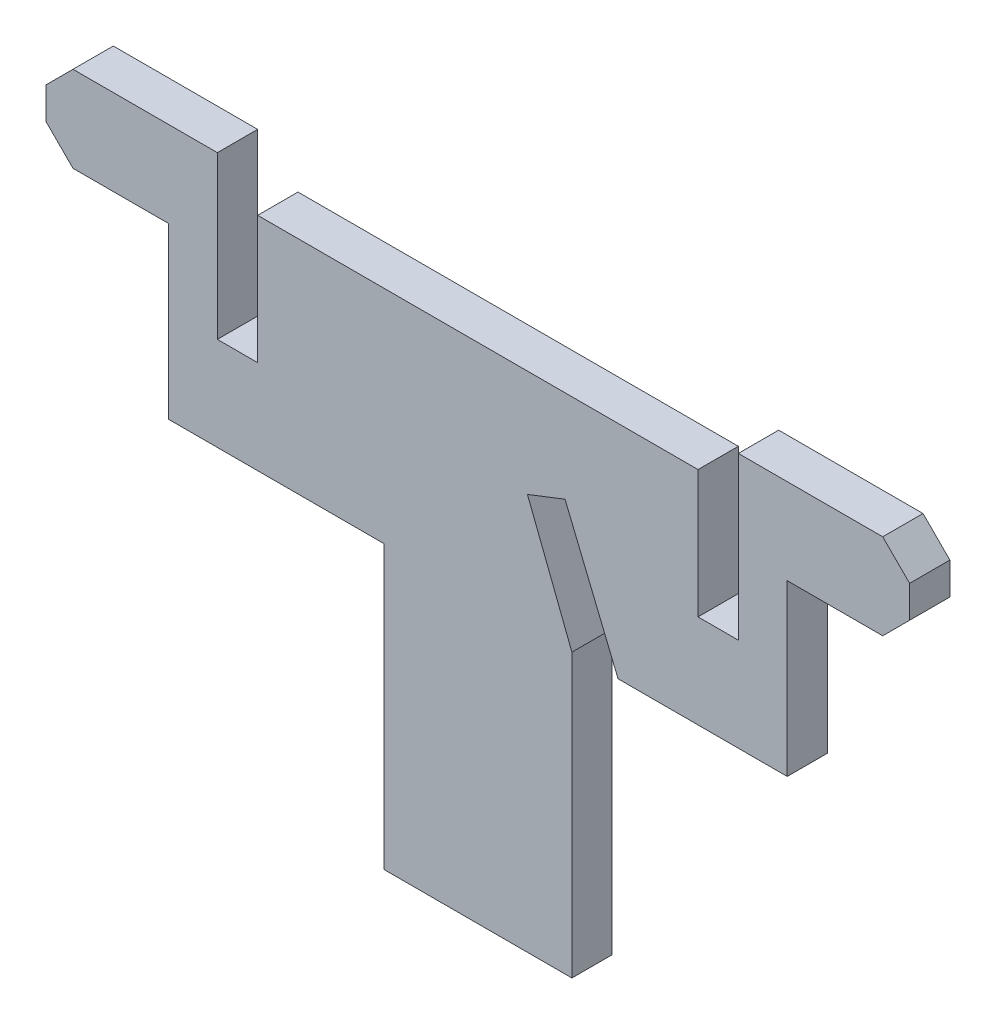
ISO-10303-21;
HEADER;
FILE_DESCRIPTION(('STEP AP214'),'2;1');
FILE_NAME('part.step','',(''),(''),'','','');
FILE_SCHEMA(('AUTOMOTIVE_DESIGN { 1 0 10303 214 1 1 1 1 }'));
ENDSEC;
DATA;
#1=APPLICATION_CONTEXT('core data for automotive mechanical design processes');
#2=APPLICATION_PROTOCOL_DEFINITION('international standard','automotive_design',2000,#1);
#3=PRODUCT_CONTEXT('',#1,'mechanical');
#4=PRODUCT('Part','Part','',(#3));
#5=PRODUCT_RELATED_PRODUCT_CATEGORY('part','',(#4));
#6=PRODUCT_DEFINITION_FORMATION('','',#4);
#7=PRODUCT_DEFINITION_CONTEXT('part definition',#1,'design');
#8=PRODUCT_DEFINITION('design','',#6,#7);
#9=PRODUCT_DEFINITION_SHAPE('','',#8);
#10=(LENGTH_UNIT() NAMED_UNIT(*) SI_UNIT(.MILLI.,.METRE.));
#11=(NAMED_UNIT(*) PLANE_ANGLE_UNIT() SI_UNIT($,.RADIAN.));
#12=(NAMED_UNIT(*) SI_UNIT($,.STERADIAN.) SOLID_ANGLE_UNIT());
#13=UNCERTAINTY_MEASURE_WITH_UNIT(LENGTH_MEASURE(1.E-05),#10,'distance_accuracy_value','');
#14=(GEOMETRIC_REPRESENTATION_CONTEXT(3) GLOBAL_UNCERTAINTY_ASSIGNED_CONTEXT((#13)) GLOBAL_UNIT_ASSIGNED_CONTEXT((#10,
#11,#12)) REPRESENTATION_CONTEXT('',''));
#15=CARTESIAN_POINT('',(0.,0.,0.));
#16=DIRECTION('',(0.,0.,1.));
#17=DIRECTION('',(1.,0.,0.));
#18=AXIS2_PLACEMENT_3D('',#15,#16,#17);
#19=CARTESIAN_POINT('',(496.63807505606,-79.1638014320061,2.99999999999992));
#20=DIRECTION('',(0.,-1.,0.));
#21=DIRECTION('',(0.,0.,-1.));
#22=AXIS2_PLACEMENT_3D('',#19,#20,#21);
#23=PLANE('',#22);
#24=DIRECTION('',(-1.,0.,0.));
#25=VECTOR('',#24,1.);
#26=CARTESIAN_POINT('',(496.63807505606,-79.1638014320061,0.));
#27=LINE('',#26,#25);
#28=CARTESIAN_POINT('',(507.382666581557,-79.1638014320062,0.));
#29=VERTEX_POINT('',#28);
#30=CARTESIAN_POINT('',(496.63807505606,-79.1638014320061,0.));
#31=VERTEX_POINT('',#30);
#32=EDGE_CURVE('E214',#29,#31,#27,.T.);
#33=ORIENTED_EDGE('',*,*,#32,.T.);
#34=DIRECTION('',(0.,0.,-1.));
#35=VECTOR('',#34,1.);
#36=CARTESIAN_POINT('',(496.63807505606,-79.1638014320061,2.99999999999992));
#37=LINE('',#36,#35);
#38=CARTESIAN_POINT('',(496.63807505606,-79.1638014320061,2.99999999999992));
#39=VERTEX_POINT('',#38);
#40=EDGE_CURVE('E11',#39,#31,#37,.T.);
#41=ORIENTED_EDGE('',*,*,#40,.F.);
#42=DIRECTION('',(-1.,0.,0.));
#43=VECTOR('',#42,1.);
#44=CARTESIAN_POINT('',(496.63807505606,-79.1638014320061,2.99999999999992));
#45=LINE('',#44,#43);
#46=CARTESIAN_POINT('',(507.382666581557,-79.1638014320062,2.99999999999989));
#47=VERTEX_POINT('',#46);
#48=EDGE_CURVE('E279',#47,#39,#45,.T.);
#49=ORIENTED_EDGE('',*,*,#48,.F.);
#50=DIRECTION('',(0.,0.,-1.));
#51=VECTOR('',#50,1.);
#52=CARTESIAN_POINT('',(507.382666581557,-79.1638014320062,2.99999999999989));
#53=LINE('',#52,#51);
#54=EDGE_CURVE('E227',#47,#29,#53,.T.);
#55=ORIENTED_EDGE('',*,*,#54,.T.);
#56=EDGE_LOOP('',(#33,#41,#49,#55));
#57=FACE_BOUND('',#56,.T.);
#58=ADVANCED_FACE('F32',(#57),#23,.F.);
#59=CARTESIAN_POINT('',(496.63807505606,-91.1989851839189,2.99999999999992));
#60=DIRECTION('',(1.,0.,0.));
#61=DIRECTION('',(0.,0.,-1.));
#62=AXIS2_PLACEMENT_3D('',#59,#60,#61);
#63=PLANE('',#62);
#64=DIRECTION('',(0.,-1.,0.));
#65=VECTOR('',#64,1.);
#66=CARTESIAN_POINT('',(496.63807505606,-91.1989851839189,-1.04083408558608E-13));
#67=LINE('',#66,#65);
#68=CARTESIAN_POINT('',(496.63807505606,-91.1989851839189,-1.04083408558608E-13));
#69=VERTEX_POINT('',#68);
#70=EDGE_CURVE('E210',#31,#69,#67,.T.);
#71=ORIENTED_EDGE('',*,*,#70,.T.);
#72=DIRECTION('',(0.,0.,-1.));
#73=VECTOR('',#72,1.);
#74=CARTESIAN_POINT('',(496.63807505606,-91.1989851839189,2.99999999999992));
#75=LINE('',#74,#73);
#76=CARTESIAN_POINT('',(496.63807505606,-91.1989851839189,2.99999999999992));
#77=VERTEX_POINT('',#76);
#78=EDGE_CURVE('E39',#77,#69,#75,.T.);
#79=ORIENTED_EDGE('',*,*,#78,.F.);
#80=DIRECTION('',(0.,-1.,0.));
#81=VECTOR('',#80,1.);
#82=CARTESIAN_POINT('',(496.63807505606,-91.1989851839189,2.99999999999992));
#83=LINE('',#82,#81);
#84=EDGE_CURVE('E223',#39,#77,#83,.T.);
#85=ORIENTED_EDGE('',*,*,#84,.F.);
#86=ORIENTED_EDGE('',*,*,#40,.T.);
#87=EDGE_LOOP('',(#71,#79,#85,#86));
#88=FACE_BOUND('',#87,.T.);
#89=ADVANCED_FACE('F222',(#88),#63,.F.);
#90=CARTESIAN_POINT('',(493.63807505606,-91.1989851839189,2.99999999999992));
#91=DIRECTION('',(0.,-1.,0.));
#92=DIRECTION('',(0.,0.,-1.));
#93=AXIS2_PLACEMENT_3D('',#90,#91,#92);
#94=PLANE('',#93);
#95=DIRECTION('',(-1.,0.,0.));
#96=VECTOR('',#95,1.);
#97=CARTESIAN_POINT('',(493.63807505606,-91.1989851839189,-1.11022302462516E-13));
#98=LINE('',#97,#96);
#99=CARTESIAN_POINT('',(493.63807505606,-91.1989851839189,-1.11022302462516E-13));
#100=VERTEX_POINT('',#99);
#101=EDGE_CURVE('E216',#69,#100,#98,.T.);
#102=ORIENTED_EDGE('',*,*,#101,.T.);
#103=DIRECTION('',(0.,0.,-1.));
#104=VECTOR('',#103,1.);
#105=CARTESIAN_POINT('',(493.63807505606,-91.1989851839189,2.99999999999992));
#106=LINE('',#105,#104);
#107=CARTESIAN_POINT('',(493.63807505606,-91.1989851839189,2.99999999999992));
#108=VERTEX_POINT('',#107);
#109=EDGE_CURVE('E400',#108,#100,#106,.T.);
#110=ORIENTED_EDGE('',*,*,#109,.F.);
#111=DIRECTION('',(-1.,0.,0.));
#112=VECTOR('',#111,1.);
#113=CARTESIAN_POINT('',(493.63807505606,-91.1989851839189,2.99999999999992));
#114=LINE('',#113,#112);
#115=EDGE_CURVE('E282',#77,#108,#114,.T.);
#116=ORIENTED_EDGE('',*,*,#115,.F.);
#117=ORIENTED_EDGE('',*,*,#78,.T.);
#118=EDGE_LOOP('',(#102,#110,#116,#117));
#119=FACE_BOUND('',#118,.T.);
#120=ADVANCED_FACE('F404',(#119),#94,.F.);
#121=CARTESIAN_POINT('',(493.63807505606,-81.7031675019215,2.99999999999992));
#122=DIRECTION('',(-1.,0.,0.));
#123=DIRECTION('',(0.,0.,1.));
#124=AXIS2_PLACEMENT_3D('',#121,#122,#123);
#125=PLANE('',#124);
#126=DIRECTION('',(0.,1.,0.));
#127=VECTOR('',#126,1.);
#128=CARTESIAN_POINT('',(493.63807505606,-81.7031675019214,0.));
#129=LINE('',#128,#127);
#130=CARTESIAN_POINT('',(493.63807505606,-81.7031675019214,0.));
#131=VERTEX_POINT('',#130);
#132=EDGE_CURVE('E231',#100,#131,#129,.T.);
#133=ORIENTED_EDGE('',*,*,#132,.T.);
#134=DIRECTION('',(0.,0.,-1.));
#135=VECTOR('',#134,1.);
#136=CARTESIAN_POINT('',(493.63807505606,-81.7031675019215,2.99999999999992));
#137=LINE('',#136,#135);
#138=CARTESIAN_POINT('',(493.63807505606,-81.7031675019215,2.99999999999992));
#139=VERTEX_POINT('',#138);
#140=EDGE_CURVE('E397',#139,#131,#137,.T.);
#141=ORIENTED_EDGE('',*,*,#140,.F.);
#142=DIRECTION('',(0.,1.,0.));
#143=VECTOR('',#142,1.);
#144=CARTESIAN_POINT('',(493.63807505606,-81.7031675019215,2.99999999999992));
#145=LINE('',#144,#143);
#146=EDGE_CURVE('E284',#108,#139,#145,.T.);
#147=ORIENTED_EDGE('',*,*,#146,.F.);
#148=ORIENTED_EDGE('',*,*,#109,.T.);
#149=EDGE_LOOP('',(#133,#141,#147,#148));
#150=FACE_BOUND('',#149,.T.);
#151=ADVANCED_FACE('F412',(#150),#125,.F.);
#152=CARTESIAN_POINT('',(493.63807505606,-81.7031675019215,2.99999999999992));
#153=DIRECTION('',(0.,-1.,0.));
#154=DIRECTION('',(0.,0.,-1.));
#155=AXIS2_PLACEMENT_3D('',#152,#153,#154);
#156=PLANE('',#155);
#157=DIRECTION('',(-1.,0.,0.));
#158=VECTOR('',#157,1.);
#159=CARTESIAN_POINT('',(493.63807505606,-81.7031675019214,0.));
#160=LINE('',#159,#158);
#161=CARTESIAN_POINT('',(460.86807505606,-81.7031675019216,0.));
#162=VERTEX_POINT('',#161);
#163=EDGE_CURVE('E233',#131,#162,#160,.T.);
#164=ORIENTED_EDGE('',*,*,#163,.T.);
#165=DIRECTION('',(0.,0.,-1.));
#166=VECTOR('',#165,1.);
#167=CARTESIAN_POINT('',(460.86807505606,-81.7031675019215,2.99999999999991));
#168=LINE('',#167,#166);
#169=CARTESIAN_POINT('',(460.86807505606,-81.7031675019215,2.99999999999991));
#170=VERTEX_POINT('',#169);
#171=EDGE_CURVE('E394',#170,#162,#168,.T.);
#172=ORIENTED_EDGE('',*,*,#171,.F.);
#173=DIRECTION('',(-1.,0.,0.));
#174=VECTOR('',#173,1.);
#175=CARTESIAN_POINT('',(493.63807505606,-81.7031675019215,2.99999999999992));
#176=LINE('',#175,#174);
#177=EDGE_CURVE('E286',#139,#170,#176,.T.);
#178=ORIENTED_EDGE('',*,*,#177,.F.);
#179=ORIENTED_EDGE('',*,*,#140,.T.);
#180=EDGE_LOOP('',(#164,#172,#178,#179));
#181=FACE_BOUND('',#180,.T.);
#182=ADVANCED_FACE('F415',(#181),#156,.F.);
#183=CARTESIAN_POINT('',(460.86807505606,-81.7031675019215,2.99999999999991));
#184=DIRECTION('',(1.,0.,0.));
#185=DIRECTION('',(0.,0.,-1.));
#186=AXIS2_PLACEMENT_3D('',#183,#184,#185);
#187=PLANE('',#186);
#188=DIRECTION('',(0.,-1.,0.));
#189=VECTOR('',#188,1.);
#190=CARTESIAN_POINT('',(460.86807505606,-81.7031675019216,0.));
#191=LINE('',#190,#189);
#192=CARTESIAN_POINT('',(460.86807505606,-91.1989851839189,0.));
#193=VERTEX_POINT('',#192);
#194=EDGE_CURVE('E235',#162,#193,#191,.T.);
#195=ORIENTED_EDGE('',*,*,#194,.T.);
#196=DIRECTION('',(0.,0.,-1.));
#197=VECTOR('',#196,1.);
#198=CARTESIAN_POINT('',(460.86807505606,-91.1989851839189,2.99999999999988));
#199=LINE('',#198,#197);
#200=CARTESIAN_POINT('',(460.86807505606,-91.1989851839189,2.99999999999988));
#201=VERTEX_POINT('',#200);
#202=EDGE_CURVE('E391',#201,#193,#199,.T.);
#203=ORIENTED_EDGE('',*,*,#202,.F.);
#204=DIRECTION('',(0.,-1.,0.));
#205=VECTOR('',#204,1.);
#206=CARTESIAN_POINT('',(460.86807505606,-81.7031675019215,2.99999999999991));
#207=LINE('',#206,#205);
#208=EDGE_CURVE('E288',#170,#201,#207,.T.);
#209=ORIENTED_EDGE('',*,*,#208,.F.);
#210=ORIENTED_EDGE('',*,*,#171,.T.);
#211=EDGE_LOOP('',(#195,#203,#209,#210));
#212=FACE_BOUND('',#211,.T.);
#213=ADVANCED_FACE('F420',(#212),#187,.F.);
#214=CARTESIAN_POINT('',(460.86807505606,-91.1989851839189,2.99999999999988));
#215=DIRECTION('',(0.,-1.,0.));
#216=DIRECTION('',(0.,0.,-1.));
#217=AXIS2_PLACEMENT_3D('',#214,#215,#216);
#218=PLANE('',#217);
#219=DIRECTION('',(-1.,0.,0.));
#220=VECTOR('',#219,1.);
#221=CARTESIAN_POINT('',(460.86807505606,-91.1989851839189,0.));
#222=LINE('',#221,#220);
#223=CARTESIAN_POINT('',(457.86807505606,-91.1989851839189,0.));
#224=VERTEX_POINT('',#223);
#225=EDGE_CURVE('E237',#193,#224,#222,.T.);
#226=ORIENTED_EDGE('',*,*,#225,.T.);
#227=DIRECTION('',(0.,0.,-1.));
#228=VECTOR('',#227,1.);
#229=CARTESIAN_POINT('',(457.86807505606,-91.198985183919,2.99999999999992));
#230=LINE('',#229,#228);
#231=CARTESIAN_POINT('',(457.86807505606,-91.198985183919,2.99999999999992));
#232=VERTEX_POINT('',#231);
#233=EDGE_CURVE('E388',#232,#224,#230,.T.);
#234=ORIENTED_EDGE('',*,*,#233,.F.);
#235=DIRECTION('',(-1.,0.,0.));
#236=VECTOR('',#235,1.);
#237=CARTESIAN_POINT('',(460.86807505606,-91.1989851839189,2.99999999999988));
#238=LINE('',#237,#236);
#239=EDGE_CURVE('E290',#201,#232,#238,.T.);
#240=ORIENTED_EDGE('',*,*,#239,.F.);
#241=ORIENTED_EDGE('',*,*,#202,.T.);
#242=EDGE_LOOP('',(#226,#234,#240,#241));
#243=FACE_BOUND('',#242,.T.);
#244=ADVANCED_FACE('F426',(#243),#218,.F.);
#245=CARTESIAN_POINT('',(457.86807505606,-91.198985183919,2.99999999999992));
#246=DIRECTION('',(-1.,0.,0.));
#247=DIRECTION('',(0.,0.,1.));
#248=AXIS2_PLACEMENT_3D('',#245,#246,#247);
#249=PLANE('',#248);
#250=DIRECTION('',(0.,1.,0.));
#251=VECTOR('',#250,1.);
#252=CARTESIAN_POINT('',(457.86807505606,-91.1989851839189,0.));
#253=LINE('',#252,#251);
#254=CARTESIAN_POINT('',(457.86807505606,-79.1638014320062,0.));
#255=VERTEX_POINT('',#254);
#256=EDGE_CURVE('E239',#224,#255,#253,.T.);
#257=ORIENTED_EDGE('',*,*,#256,.T.);
#258=DIRECTION('',(0.,0.,-1.));
#259=VECTOR('',#258,1.);
#260=CARTESIAN_POINT('',(457.86807505606,-79.1638014320061,2.99999999999991));
#261=LINE('',#260,#259);
#262=CARTESIAN_POINT('',(457.86807505606,-79.1638014320061,2.99999999999991));
#263=VERTEX_POINT('',#262);
#264=EDGE_CURVE('E385',#263,#255,#261,.T.);
#265=ORIENTED_EDGE('',*,*,#264,.F.);
#266=DIRECTION('',(0.,1.,0.));
#267=VECTOR('',#266,1.);
#268=CARTESIAN_POINT('',(457.86807505606,-91.198985183919,2.99999999999992));
#269=LINE('',#268,#267);
#270=EDGE_CURVE('E292',#232,#263,#269,.T.);
#271=ORIENTED_EDGE('',*,*,#270,.F.);
#272=ORIENTED_EDGE('',*,*,#233,.T.);
#273=EDGE_LOOP('',(#257,#265,#271,#272));
#274=FACE_BOUND('',#273,.T.);
#275=ADVANCED_FACE('F430',(#274),#249,.F.);
#276=CARTESIAN_POINT('',(457.86807505606,-79.1638014320061,2.99999999999991));
#277=DIRECTION('',(0.,-1.,0.));
#278=DIRECTION('',(1.,0.,0.));
#279=AXIS2_PLACEMENT_3D('',#276,#277,#278);
#280=PLANE('',#279);
#281=DIRECTION('',(-1.,0.,0.));
#282=VECTOR('',#281,1.);
#283=CARTESIAN_POINT('',(457.86807505606,-79.1638014320062,0.));
#284=LINE('',#283,#282);
#285=CARTESIAN_POINT('',(447.123483530564,-79.1638014320062,0.));
#286=VERTEX_POINT('',#285);
#287=EDGE_CURVE('E241',#255,#286,#284,.T.);
#288=ORIENTED_EDGE('',*,*,#287,.T.);
#289=DIRECTION('',(0.,0.,-1.));
#290=VECTOR('',#289,1.);
#291=CARTESIAN_POINT('',(447.123483530564,-79.1638014320062,2.99999999999993));
#292=LINE('',#291,#290);
#293=CARTESIAN_POINT('',(447.123483530564,-79.1638014320062,2.99999999999993));
#294=VERTEX_POINT('',#293);
#295=EDGE_CURVE('E382',#294,#286,#292,.T.);
#296=ORIENTED_EDGE('',*,*,#295,.F.);
#297=DIRECTION('',(-1.,0.,0.));
#298=VECTOR('',#297,1.);
#299=CARTESIAN_POINT('',(457.86807505606,-79.1638014320061,2.99999999999991));
#300=LINE('',#299,#298);
#301=EDGE_CURVE('E294',#263,#294,#300,.T.);
#302=ORIENTED_EDGE('',*,*,#301,.F.);
#303=ORIENTED_EDGE('',*,*,#264,.T.);
#304=EDGE_LOOP('',(#288,#296,#302,#303));
#305=FACE_BOUND('',#304,.T.);
#306=ADVANCED_FACE('F435',(#305),#280,.F.);
#307=CARTESIAN_POINT('',(447.123483530564,-79.1638014320062,2.99999999999993));
#308=DIRECTION('',(0.707106781186548,-0.707106781186548,0.));
#309=DIRECTION('',(0.707106781186548,0.707106781186548,0.));
#310=AXIS2_PLACEMENT_3D('',#307,#308,#309);
#311=PLANE('',#310);
#312=DIRECTION('',(-0.707106781186548,-0.707106781186547,0.));
#313=VECTOR('',#312,1.);
#314=CARTESIAN_POINT('',(447.123483530564,-79.1638014320062,0.));
#315=LINE('',#314,#313);
#316=CARTESIAN_POINT('',(445.123483530564,-81.1638014320062,0.));
#317=VERTEX_POINT('',#316);
#318=EDGE_CURVE('E243',#286,#317,#315,.T.);
#319=ORIENTED_EDGE('',*,*,#318,.T.);
#320=DIRECTION('',(0.,0.,-1.));
#321=VECTOR('',#320,1.);
#322=CARTESIAN_POINT('',(445.123483530564,-81.1638014320062,2.99999999999998));
#323=LINE('',#322,#321);
#324=CARTESIAN_POINT('',(445.123483530564,-81.1638014320062,2.99999999999998));
#325=VERTEX_POINT('',#324);
#326=EDGE_CURVE('E379',#325,#317,#323,.T.);
#327=ORIENTED_EDGE('',*,*,#326,.F.);
#328=DIRECTION('',(-0.707106781186548,-0.707106781186547,0.));
#329=VECTOR('',#328,1.);
#330=CARTESIAN_POINT('',(447.123483530564,-79.1638014320062,2.99999999999993));
#331=LINE('',#330,#329);
#332=EDGE_CURVE('E296',#294,#325,#331,.T.);
#333=ORIENTED_EDGE('',*,*,#332,.F.);
#334=ORIENTED_EDGE('',*,*,#295,.T.);
#335=EDGE_LOOP('',(#319,#327,#333,#334));
#336=FACE_BOUND('',#335,.T.);
#337=ADVANCED_FACE('F441',(#336),#311,.F.);
#338=CARTESIAN_POINT('',(445.123483530564,-81.1638014320062,2.99999999999998));
#339=DIRECTION('',(1.,0.,0.));
#340=DIRECTION('',(0.,0.,-1.));
#341=AXIS2_PLACEMENT_3D('',#338,#339,#340);
#342=PLANE('',#341);
#343=DIRECTION('',(0.,-1.,0.));
#344=VECTOR('',#343,1.);
#345=CARTESIAN_POINT('',(445.123483530564,-81.1638014320062,0.));
#346=LINE('',#345,#344);
#347=CARTESIAN_POINT('',(445.123483530564,-83.5461032639372,0.));
#348=VERTEX_POINT('',#347);
#349=EDGE_CURVE('E245',#317,#348,#346,.T.);
#350=ORIENTED_EDGE('',*,*,#349,.T.);
#351=DIRECTION('',(0.,0.,-1.));
#352=VECTOR('',#351,1.);
#353=CARTESIAN_POINT('',(445.123483530564,-83.5461032639373,2.99999999999993));
#354=LINE('',#353,#352);
#355=CARTESIAN_POINT('',(445.123483530564,-83.5461032639373,2.99999999999993));
#356=VERTEX_POINT('',#355);
#357=EDGE_CURVE('E376',#356,#348,#354,.T.);
#358=ORIENTED_EDGE('',*,*,#357,.F.);
#359=DIRECTION('',(0.,-1.,0.));
#360=VECTOR('',#359,1.);
#361=CARTESIAN_POINT('',(445.123483530564,-81.1638014320062,2.99999999999998));
#362=LINE('',#361,#360);
#363=EDGE_CURVE('E298',#325,#356,#362,.T.);
#364=ORIENTED_EDGE('',*,*,#363,.F.);
#365=ORIENTED_EDGE('',*,*,#326,.T.);
#366=EDGE_LOOP('',(#350,#358,#364,#365));
#367=FACE_BOUND('',#366,.T.);
#368=ADVANCED_FACE('F445',(#367),#342,.F.);
#369=CARTESIAN_POINT('',(445.123483530564,-83.5461032639373,2.99999999999993));
#370=DIRECTION('',(0.707106781186548,0.707106781186548,0.));
#371=DIRECTION('',(-0.707106781186548,0.707106781186548,0.));
#372=AXIS2_PLACEMENT_3D('',#369,#370,#371);
#373=PLANE('',#372);
#374=DIRECTION('',(0.707106781186548,-0.707106781186548,0.));
#375=VECTOR('',#374,1.);
#376=CARTESIAN_POINT('',(445.123483530564,-83.5461032639372,0.));
#377=LINE('',#376,#375);
#378=CARTESIAN_POINT('',(447.123483530564,-85.5461032639372,0.));
#379=VERTEX_POINT('',#378);
#380=EDGE_CURVE('E247',#348,#379,#377,.T.);
#381=ORIENTED_EDGE('',*,*,#380,.T.);
#382=DIRECTION('',(0.,0.,-1.));
#383=VECTOR('',#382,1.);
#384=CARTESIAN_POINT('',(447.123483530564,-85.5461032639372,2.99999999999992));
#385=LINE('',#384,#383);
#386=CARTESIAN_POINT('',(447.123483530564,-85.5461032639372,2.99999999999992));
#387=VERTEX_POINT('',#386);
#388=EDGE_CURVE('E373',#387,#379,#385,.T.);
#389=ORIENTED_EDGE('',*,*,#388,.F.);
#390=DIRECTION('',(0.707106781186548,-0.707106781186548,0.));
#391=VECTOR('',#390,1.);
#392=CARTESIAN_POINT('',(445.123483530564,-83.5461032639373,2.99999999999993));
#393=LINE('',#392,#391);
#394=EDGE_CURVE('E300',#356,#387,#393,.T.);
#395=ORIENTED_EDGE('',*,*,#394,.F.);
#396=ORIENTED_EDGE('',*,*,#357,.T.);
#397=EDGE_LOOP('',(#381,#389,#395,#396));
#398=FACE_BOUND('',#397,.T.);
#399=ADVANCED_FACE('F450',(#398),#373,.F.);
#400=CARTESIAN_POINT('',(454.229360790744,-85.5461032639372,2.99999999999991));
#401=DIRECTION('',(0.,1.,0.));
#402=DIRECTION('',(-1.,0.,0.));
#403=AXIS2_PLACEMENT_3D('',#400,#401,#402);
#404=PLANE('',#403);
#405=DIRECTION('',(1.,0.,0.));
#406=VECTOR('',#405,1.);
#407=CARTESIAN_POINT('',(454.229360790744,-85.5461032639372,0.));
#408=LINE('',#407,#406);
#409=CARTESIAN_POINT('',(454.229360790744,-85.5461032639372,0.));
#410=VERTEX_POINT('',#409);
#411=EDGE_CURVE('E249',#379,#410,#408,.T.);
#412=ORIENTED_EDGE('',*,*,#411,.T.);
#413=DIRECTION('',(0.,0.,-1.));
#414=VECTOR('',#413,1.);
#415=CARTESIAN_POINT('',(454.229360790744,-85.5461032639372,2.99999999999991));
#416=LINE('',#415,#414);
#417=CARTESIAN_POINT('',(454.229360790744,-85.5461032639372,2.99999999999991));
#418=VERTEX_POINT('',#417);
#419=EDGE_CURVE('E370',#418,#410,#416,.T.);
#420=ORIENTED_EDGE('',*,*,#419,.F.);
#421=DIRECTION('',(1.,0.,0.));
#422=VECTOR('',#421,1.);
#423=CARTESIAN_POINT('',(454.229360790744,-85.5461032639372,2.99999999999991));
#424=LINE('',#423,#422);
#425=EDGE_CURVE('E302',#387,#418,#424,.T.);
#426=ORIENTED_EDGE('',*,*,#425,.F.);
#427=ORIENTED_EDGE('',*,*,#388,.T.);
#428=EDGE_LOOP('',(#412,#420,#426,#427));
#429=FACE_BOUND('',#428,.T.);
#430=ADVANCED_FACE('F456',(#429),#404,.F.);
#431=CARTESIAN_POINT('',(454.229360790744,-98.1640017704589,2.99999999999995));
#432=DIRECTION('',(1.,0.,0.));
#433=DIRECTION('',(0.,0.,-1.));
#434=AXIS2_PLACEMENT_3D('',#431,#432,#433);
#435=PLANE('',#434);
#436=DIRECTION('',(0.,-1.,0.));
#437=VECTOR('',#436,1.);
#438=CARTESIAN_POINT('',(454.229360790744,-98.1640017704589,0.));
#439=LINE('',#438,#437);
#440=CARTESIAN_POINT('',(454.229360790744,-98.1640017704589,0.));
#441=VERTEX_POINT('',#440);
#442=EDGE_CURVE('E251',#410,#441,#439,.T.);
#443=ORIENTED_EDGE('',*,*,#442,.T.);
#444=DIRECTION('',(0.,0.,-1.));
#445=VECTOR('',#444,1.);
#446=CARTESIAN_POINT('',(454.229360790744,-98.1640017704589,2.99999999999995));
#447=LINE('',#446,#445);
#448=CARTESIAN_POINT('',(454.229360790744,-98.1640017704589,2.99999999999995));
#449=VERTEX_POINT('',#448);
#450=EDGE_CURVE('E367',#449,#441,#447,.T.);
#451=ORIENTED_EDGE('',*,*,#450,.F.);
#452=DIRECTION('',(0.,-1.,0.));
#453=VECTOR('',#452,1.);
#454=CARTESIAN_POINT('',(454.229360790744,-98.1640017704589,2.99999999999995));
#455=LINE('',#454,#453);
#456=EDGE_CURVE('E304',#418,#449,#455,.T.);
#457=ORIENTED_EDGE('',*,*,#456,.F.);
#458=ORIENTED_EDGE('',*,*,#419,.T.);
#459=EDGE_LOOP('',(#443,#451,#457,#458));
#460=FACE_BOUND('',#459,.T.);
#461=ADVANCED_FACE('F460',(#460),#435,.F.);
#462=CARTESIAN_POINT('',(454.229360790744,-98.1640017704589,2.99999999999995));
#463=DIRECTION('',(0.,1.,0.));
#464=DIRECTION('',(0.,0.,1.));
#465=AXIS2_PLACEMENT_3D('',#462,#463,#464);
#466=PLANE('',#465);
#467=DIRECTION('',(1.,0.,0.));
#468=VECTOR('',#467,1.);
#469=CARTESIAN_POINT('',(454.229360790744,-98.1640017704589,0.));
#470=LINE('',#469,#468);
#471=CARTESIAN_POINT('',(470.25307505606,-98.1640017704589,0.));
#472=VERTEX_POINT('',#471);
#473=EDGE_CURVE('E253',#441,#472,#470,.T.);
#474=ORIENTED_EDGE('',*,*,#473,.T.);
#475=DIRECTION('',(0.,0.,-1.));
#476=VECTOR('',#475,1.);
#477=CARTESIAN_POINT('',(470.25307505606,-98.1640017704589,2.99999999999989));
#478=LINE('',#477,#476);
#479=CARTESIAN_POINT('',(470.25307505606,-98.1640017704589,2.99999999999989));
#480=VERTEX_POINT('',#479);
#481=EDGE_CURVE('E364',#480,#472,#478,.T.);
#482=ORIENTED_EDGE('',*,*,#481,.F.);
#483=DIRECTION('',(1.,0.,0.));
#484=VECTOR('',#483,1.);
#485=CARTESIAN_POINT('',(454.229360790744,-98.1640017704589,2.99999999999995));
#486=LINE('',#485,#484);
#487=EDGE_CURVE('E306',#449,#480,#486,.T.);
#488=ORIENTED_EDGE('',*,*,#487,.F.);
#489=ORIENTED_EDGE('',*,*,#450,.T.);
#490=EDGE_LOOP('',(#474,#482,#488,#489));
#491=FACE_BOUND('',#490,.T.);
#492=ADVANCED_FACE('F465',(#491),#466,.F.);
#493=CARTESIAN_POINT('',(470.25307505606,-119.164001770459,2.99999999999987));
#494=DIRECTION('',(1.,0.,0.));
#495=DIRECTION('',(0.,0.,-1.));
#496=AXIS2_PLACEMENT_3D('',#493,#494,#495);
#497=PLANE('',#496);
#498=DIRECTION('',(0.,-1.,0.));
#499=VECTOR('',#498,1.);
#500=CARTESIAN_POINT('',(470.25307505606,-119.164001770459,0.));
#501=LINE('',#500,#499);
#502=CARTESIAN_POINT('',(470.25307505606,-119.164001770459,0.));
#503=VERTEX_POINT('',#502);
#504=EDGE_CURVE('E255',#472,#503,#501,.T.);
#505=ORIENTED_EDGE('',*,*,#504,.T.);
#506=DIRECTION('',(0.,0.,-1.));
#507=VECTOR('',#506,1.);
#508=CARTESIAN_POINT('',(470.25307505606,-119.164001770459,2.99999999999987));
#509=LINE('',#508,#507);
#510=CARTESIAN_POINT('',(470.25307505606,-119.164001770459,2.99999999999987));
#511=VERTEX_POINT('',#510);
#512=EDGE_CURVE('E361',#511,#503,#509,.T.);
#513=ORIENTED_EDGE('',*,*,#512,.F.);
#514=DIRECTION('',(0.,-1.,0.));
#515=VECTOR('',#514,1.);
#516=CARTESIAN_POINT('',(470.25307505606,-119.164001770459,2.99999999999987));
#517=LINE('',#516,#515);
#518=EDGE_CURVE('E308',#480,#511,#517,.T.);
#519=ORIENTED_EDGE('',*,*,#518,.F.);
#520=ORIENTED_EDGE('',*,*,#481,.T.);
#521=EDGE_LOOP('',(#505,#513,#519,#520));
#522=FACE_BOUND('',#521,.T.);
#523=ADVANCED_FACE('F471',(#522),#497,.F.);
#524=CARTESIAN_POINT('',(470.25307505606,-119.164001770459,2.99999999999987));
#525=DIRECTION('',(0.,1.,0.));
#526=DIRECTION('',(0.,0.,1.));
#527=AXIS2_PLACEMENT_3D('',#524,#525,#526);
#528=PLANE('',#527);
#529=DIRECTION('',(1.,0.,0.));
#530=VECTOR('',#529,1.);
#531=CARTESIAN_POINT('',(470.25307505606,-119.164001770459,0.));
#532=LINE('',#531,#530);
#533=CARTESIAN_POINT('',(484.25307505606,-119.164001770459,0.));
#534=VERTEX_POINT('',#533);
#535=EDGE_CURVE('E257',#503,#534,#532,.T.);
#536=ORIENTED_EDGE('',*,*,#535,.T.);
#537=DIRECTION('',(0.,0.,-1.));
#538=VECTOR('',#537,1.);
#539=CARTESIAN_POINT('',(484.25307505606,-119.164001770459,2.99999999999991));
#540=LINE('',#539,#538);
#541=CARTESIAN_POINT('',(484.25307505606,-119.164001770459,2.99999999999991));
#542=VERTEX_POINT('',#541);
#543=EDGE_CURVE('E358',#542,#534,#540,.T.);
#544=ORIENTED_EDGE('',*,*,#543,.F.);
#545=DIRECTION('',(1.,0.,0.));
#546=VECTOR('',#545,1.);
#547=CARTESIAN_POINT('',(470.25307505606,-119.164001770459,2.99999999999987));
#548=LINE('',#547,#546);
#549=EDGE_CURVE('E310',#511,#542,#548,.T.);
#550=ORIENTED_EDGE('',*,*,#549,.F.);
#551=ORIENTED_EDGE('',*,*,#512,.T.);
#552=EDGE_LOOP('',(#536,#544,#550,#551));
#553=FACE_BOUND('',#552,.T.);
#554=ADVANCED_FACE('F475',(#553),#528,.F.);
#555=CARTESIAN_POINT('',(484.25307505606,-119.164001770459,2.99999999999991));
#556=DIRECTION('',(-1.,0.,0.));
#557=DIRECTION('',(0.,-1.,0.));
#558=AXIS2_PLACEMENT_3D('',#555,#556,#557);
#559=PLANE('',#558);
#560=DIRECTION('',(0.,1.,0.));
#561=VECTOR('',#560,1.);
#562=CARTESIAN_POINT('',(484.25307505606,-119.164001770459,0.));
#563=LINE('',#562,#561);
#564=CARTESIAN_POINT('',(484.25307505606,-98.1640017704589,0.));
#565=VERTEX_POINT('',#564);
#566=EDGE_CURVE('E259',#534,#565,#563,.T.);
#567=ORIENTED_EDGE('',*,*,#566,.T.);
#568=DIRECTION('',(0.,0.,-1.));
#569=VECTOR('',#568,1.);
#570=CARTESIAN_POINT('',(484.25307505606,-98.1640017704589,2.99999999999989));
#571=LINE('',#570,#569);
#572=CARTESIAN_POINT('',(484.25307505606,-98.1640017704589,2.99999999999989));
#573=VERTEX_POINT('',#572);
#574=EDGE_CURVE('E355',#573,#565,#571,.T.);
#575=ORIENTED_EDGE('',*,*,#574,.F.);
#576=DIRECTION('',(0.,1.,0.));
#577=VECTOR('',#576,1.);
#578=CARTESIAN_POINT('',(484.25307505606,-119.164001770459,2.99999999999991));
#579=LINE('',#578,#577);
#580=EDGE_CURVE('E312',#542,#573,#579,.T.);
#581=ORIENTED_EDGE('',*,*,#580,.F.);
#582=ORIENTED_EDGE('',*,*,#543,.T.);
#583=EDGE_LOOP('',(#567,#575,#581,#582));
#584=FACE_BOUND('',#583,.T.);
#585=ADVANCED_FACE('F480',(#584),#559,.F.);
#586=CARTESIAN_POINT('',(480.944444947203,-89.6517126553691,2.99999999999994));
#587=DIRECTION('',(-0.932067705509757,-0.362284132064568,0.));
#588=DIRECTION('',(0.362284132064568,-0.932067705509757,0.));
#589=AXIS2_PLACEMENT_3D('',#586,#587,#588);
#590=PLANE('',#589);
#591=DIRECTION('',(-0.362284132064568,0.932067705509757,0.));
#592=VECTOR('',#591,1.);
#593=CARTESIAN_POINT('',(480.944444947203,-89.6517126553692,0.));
#594=LINE('',#593,#592);
#595=CARTESIAN_POINT('',(480.944444947203,-89.6517126553692,0.));
#596=VERTEX_POINT('',#595);
#597=EDGE_CURVE('E261',#565,#596,#594,.T.);
#598=ORIENTED_EDGE('',*,*,#597,.T.);
#599=DIRECTION('',(0.,0.,-1.));
#600=VECTOR('',#599,1.);
#601=CARTESIAN_POINT('',(480.944444947203,-89.6517126553691,2.99999999999994));
#602=LINE('',#601,#600);
#603=CARTESIAN_POINT('',(480.944444947203,-89.6517126553691,2.99999999999994));
#604=VERTEX_POINT('',#603);
#605=EDGE_CURVE('E352',#604,#596,#602,.T.);
#606=ORIENTED_EDGE('',*,*,#605,.F.);
#607=DIRECTION('',(-0.362284132064568,0.932067705509757,0.));
#608=VECTOR('',#607,1.);
#609=CARTESIAN_POINT('',(480.944444947203,-89.6517126553691,2.99999999999994));
#610=LINE('',#609,#608);
#611=EDGE_CURVE('E314',#573,#604,#610,.T.);
#612=ORIENTED_EDGE('',*,*,#611,.F.);
#613=ORIENTED_EDGE('',*,*,#574,.T.);
#614=EDGE_LOOP('',(#598,#606,#612,#613));
#615=FACE_BOUND('',#614,.T.);
#616=ADVANCED_FACE('F486',(#615),#590,.F.);
#617=CARTESIAN_POINT('',(483.740648063732,-88.5648602591755,2.99999999999994));
#618=DIRECTION('',(-0.36228413206457,0.932067705509756,0.));
#619=DIRECTION('',(-0.932067705509756,-0.36228413206457,0.));
#620=AXIS2_PLACEMENT_3D('',#617,#618,#619);
#621=PLANE('',#620);
#622=DIRECTION('',(0.932067705509756,0.36228413206457,0.));
#623=VECTOR('',#622,1.);
#624=CARTESIAN_POINT('',(483.740648063732,-88.5648602591754,0.));
#625=LINE('',#624,#623);
#626=CARTESIAN_POINT('',(483.740648063732,-88.5648602591754,0.));
#627=VERTEX_POINT('',#626);
#628=EDGE_CURVE('E263',#596,#627,#625,.T.);
#629=ORIENTED_EDGE('',*,*,#628,.T.);
#630=DIRECTION('',(0.,0.,-1.));
#631=VECTOR('',#630,1.);
#632=CARTESIAN_POINT('',(483.740648063732,-88.5648602591755,2.99999999999994));
#633=LINE('',#632,#631);
#634=CARTESIAN_POINT('',(483.740648063732,-88.5648602591755,2.99999999999994));
#635=VERTEX_POINT('',#634);
#636=EDGE_CURVE('E349',#635,#627,#633,.T.);
#637=ORIENTED_EDGE('',*,*,#636,.F.);
#638=DIRECTION('',(0.932067705509756,0.36228413206457,0.));
#639=VECTOR('',#638,1.);
#640=CARTESIAN_POINT('',(483.740648063732,-88.5648602591755,2.99999999999994));
#641=LINE('',#640,#639);
#642=EDGE_CURVE('E316',#604,#635,#641,.T.);
#643=ORIENTED_EDGE('',*,*,#642,.F.);
#644=ORIENTED_EDGE('',*,*,#605,.T.);
#645=EDGE_LOOP('',(#629,#637,#643,#644));
#646=FACE_BOUND('',#645,.T.);
#647=ADVANCED_FACE('F490',(#646),#621,.F.);
#648=CARTESIAN_POINT('',(487.686287766377,-98.1640017704589,2.99999999999995));
#649=DIRECTION('',(0.924913620175286,0.380177320752105,0.));
#650=DIRECTION('',(-0.380177320752104,0.924913620175286,0.));
#651=AXIS2_PLACEMENT_3D('',#648,#649,#650);
#652=PLANE('',#651);
#653=DIRECTION('',(0.380177320752104,-0.924913620175285,0.));
#654=VECTOR('',#653,1.);
#655=CARTESIAN_POINT('',(487.686287766377,-98.1640017704589,0.));
#656=LINE('',#655,#654);
#657=CARTESIAN_POINT('',(487.686287766377,-98.1640017704589,0.));
#658=VERTEX_POINT('',#657);
#659=EDGE_CURVE('E265',#627,#658,#656,.T.);
#660=ORIENTED_EDGE('',*,*,#659,.T.);
#661=DIRECTION('',(0.,0.,-1.));
#662=VECTOR('',#661,1.);
#663=CARTESIAN_POINT('',(487.686287766377,-98.1640017704589,2.99999999999995));
#664=LINE('',#663,#662);
#665=CARTESIAN_POINT('',(487.686287766377,-98.1640017704589,2.99999999999995));
#666=VERTEX_POINT('',#665);
#667=EDGE_CURVE('E346',#666,#658,#664,.T.);
#668=ORIENTED_EDGE('',*,*,#667,.F.);
#669=DIRECTION('',(0.380177320752104,-0.924913620175285,0.));
#670=VECTOR('',#669,1.);
#671=CARTESIAN_POINT('',(487.686287766377,-98.1640017704589,2.99999999999995));
#672=LINE('',#671,#670);
#673=EDGE_CURVE('E318',#635,#666,#672,.T.);
#674=ORIENTED_EDGE('',*,*,#673,.F.);
#675=ORIENTED_EDGE('',*,*,#636,.T.);
#676=EDGE_LOOP('',(#660,#668,#674,#675));
#677=FACE_BOUND('',#676,.T.);
#678=ADVANCED_FACE('F495',(#677),#652,.F.);
#679=CARTESIAN_POINT('',(500.276789321377,-98.164001770459,2.99999999999992));
#680=DIRECTION('',(0.,1.,0.));
#681=DIRECTION('',(0.,0.,1.));
#682=AXIS2_PLACEMENT_3D('',#679,#680,#681);
#683=PLANE('',#682);
#684=DIRECTION('',(1.,0.,0.));
#685=VECTOR('',#684,1.);
#686=CARTESIAN_POINT('',(500.276789321377,-98.1640017704589,0.));
#687=LINE('',#686,#685);
#688=CARTESIAN_POINT('',(500.276789321377,-98.1640017704589,0.));
#689=VERTEX_POINT('',#688);
#690=EDGE_CURVE('E267',#658,#689,#687,.T.);
#691=ORIENTED_EDGE('',*,*,#690,.T.);
#692=DIRECTION('',(0.,0.,-1.));
#693=VECTOR('',#692,1.);
#694=CARTESIAN_POINT('',(500.276789321377,-98.164001770459,2.99999999999992));
#695=LINE('',#694,#693);
#696=CARTESIAN_POINT('',(500.276789321377,-98.164001770459,2.99999999999992));
#697=VERTEX_POINT('',#696);
#698=EDGE_CURVE('E343',#697,#689,#695,.T.);
#699=ORIENTED_EDGE('',*,*,#698,.F.);
#700=DIRECTION('',(1.,0.,0.));
#701=VECTOR('',#700,1.);
#702=CARTESIAN_POINT('',(500.276789321377,-98.164001770459,2.99999999999992));
#703=LINE('',#702,#701);
#704=EDGE_CURVE('E320',#666,#697,#703,.T.);
#705=ORIENTED_EDGE('',*,*,#704,.F.);
#706=ORIENTED_EDGE('',*,*,#667,.T.);
#707=EDGE_LOOP('',(#691,#699,#705,#706));
#708=FACE_BOUND('',#707,.T.);
#709=ADVANCED_FACE('F501',(#708),#683,.F.);
#710=CARTESIAN_POINT('',(500.276789321377,-98.164001770459,2.99999999999992));
#711=DIRECTION('',(-1.,0.,0.));
#712=DIRECTION('',(0.,0.,1.));
#713=AXIS2_PLACEMENT_3D('',#710,#711,#712);
#714=PLANE('',#713);
#715=DIRECTION('',(0.,1.,0.));
#716=VECTOR('',#715,1.);
#717=CARTESIAN_POINT('',(500.276789321377,-98.1640017704589,0.));
#718=LINE('',#717,#716);
#719=CARTESIAN_POINT('',(500.276789321377,-85.5461032639372,0.));
#720=VERTEX_POINT('',#719);
#721=EDGE_CURVE('E269',#689,#720,#718,.T.);
#722=ORIENTED_EDGE('',*,*,#721,.T.);
#723=DIRECTION('',(0.,0.,-1.));
#724=VECTOR('',#723,1.);
#725=CARTESIAN_POINT('',(500.276789321377,-85.5461032639372,2.99999999999991));
#726=LINE('',#725,#724);
#727=CARTESIAN_POINT('',(500.276789321377,-85.5461032639372,2.99999999999991));
#728=VERTEX_POINT('',#727);
#729=EDGE_CURVE('E340',#728,#720,#726,.T.);
#730=ORIENTED_EDGE('',*,*,#729,.F.);
#731=DIRECTION('',(0.,1.,0.));
#732=VECTOR('',#731,1.);
#733=CARTESIAN_POINT('',(500.276789321377,-98.164001770459,2.99999999999992));
#734=LINE('',#733,#732);
#735=EDGE_CURVE('E322',#697,#728,#734,.T.);
#736=ORIENTED_EDGE('',*,*,#735,.F.);
#737=ORIENTED_EDGE('',*,*,#698,.T.);
#738=EDGE_LOOP('',(#722,#730,#736,#737));
#739=FACE_BOUND('',#738,.T.);
#740=ADVANCED_FACE('F505',(#739),#714,.F.);
#741=CARTESIAN_POINT('',(500.276789321377,-85.5461032639372,2.99999999999991));
#742=DIRECTION('',(0.,1.,0.));
#743=DIRECTION('',(0.,0.,1.));
#744=AXIS2_PLACEMENT_3D('',#741,#742,#743);
#745=PLANE('',#744);
#746=DIRECTION('',(1.,0.,0.));
#747=VECTOR('',#746,1.);
#748=CARTESIAN_POINT('',(500.276789321377,-85.5461032639372,0.));
#749=LINE('',#748,#747);
#750=CARTESIAN_POINT('',(507.382666581557,-85.5461032639372,0.));
#751=VERTEX_POINT('',#750);
#752=EDGE_CURVE('E271',#720,#751,#749,.T.);
#753=ORIENTED_EDGE('',*,*,#752,.T.);
#754=DIRECTION('',(0.,0.,-1.));
#755=VECTOR('',#754,1.);
#756=CARTESIAN_POINT('',(507.382666581557,-85.5461032639372,2.99999999999992));
#757=LINE('',#756,#755);
#758=CARTESIAN_POINT('',(507.382666581557,-85.5461032639372,2.99999999999992));
#759=VERTEX_POINT('',#758);
#760=EDGE_CURVE('E337',#759,#751,#757,.T.);
#761=ORIENTED_EDGE('',*,*,#760,.F.);
#762=DIRECTION('',(1.,0.,0.));
#763=VECTOR('',#762,1.);
#764=CARTESIAN_POINT('',(500.276789321377,-85.5461032639372,2.99999999999991));
#765=LINE('',#764,#763);
#766=EDGE_CURVE('E324',#728,#759,#765,.T.);
#767=ORIENTED_EDGE('',*,*,#766,.F.);
#768=ORIENTED_EDGE('',*,*,#729,.T.);
#769=EDGE_LOOP('',(#753,#761,#767,#768));
#770=FACE_BOUND('',#769,.T.);
#771=ADVANCED_FACE('F510',(#770),#745,.F.);
#772=CARTESIAN_POINT('',(509.382666581557,-83.5461032639372,2.99999999999995));
#773=DIRECTION('',(-0.707106781186548,0.707106781186548,0.));
#774=DIRECTION('',(-0.707106781186548,-0.707106781186548,0.));
#775=AXIS2_PLACEMENT_3D('',#772,#773,#774);
#776=PLANE('',#775);
#777=DIRECTION('',(0.707106781186548,0.707106781186547,0.));
#778=VECTOR('',#777,1.);
#779=CARTESIAN_POINT('',(509.382666581557,-83.5461032639372,0.));
#780=LINE('',#779,#778);
#781=CARTESIAN_POINT('',(509.382666581557,-83.5461032639372,0.));
#782=VERTEX_POINT('',#781);
#783=EDGE_CURVE('E273',#751,#782,#780,.T.);
#784=ORIENTED_EDGE('',*,*,#783,.T.);
#785=DIRECTION('',(0.,0.,-1.));
#786=VECTOR('',#785,1.);
#787=CARTESIAN_POINT('',(509.382666581557,-83.5461032639372,2.99999999999995));
#788=LINE('',#787,#786);
#789=CARTESIAN_POINT('',(509.382666581557,-83.5461032639372,2.99999999999995));
#790=VERTEX_POINT('',#789);
#791=EDGE_CURVE('E334',#790,#782,#788,.T.);
#792=ORIENTED_EDGE('',*,*,#791,.F.);
#793=DIRECTION('',(0.707106781186548,0.707106781186547,0.));
#794=VECTOR('',#793,1.);
#795=CARTESIAN_POINT('',(509.382666581557,-83.5461032639372,2.99999999999995));
#796=LINE('',#795,#794);
#797=EDGE_CURVE('E326',#759,#790,#796,.T.);
#798=ORIENTED_EDGE('',*,*,#797,.F.);
#799=ORIENTED_EDGE('',*,*,#760,.T.);
#800=EDGE_LOOP('',(#784,#792,#798,#799));
#801=FACE_BOUND('',#800,.T.);
#802=ADVANCED_FACE('F514',(#801),#776,.F.);
#803=CARTESIAN_POINT('',(509.382666581557,-81.1638014320062,2.99999999999993));
#804=DIRECTION('',(-1.,0.,0.));
#805=DIRECTION('',(0.,0.,1.));
#806=AXIS2_PLACEMENT_3D('',#803,#804,#805);
#807=PLANE('',#806);
#808=DIRECTION('',(0.,1.,0.));
#809=VECTOR('',#808,1.);
#810=CARTESIAN_POINT('',(509.382666581557,-81.1638014320062,-1.2490009027033E-13));
#811=LINE('',#810,#809);
#812=CARTESIAN_POINT('',(509.382666581557,-81.1638014320062,-1.2490009027033E-13));
#813=VERTEX_POINT('',#812);
#814=EDGE_CURVE('E275',#782,#813,#811,.T.);
#815=ORIENTED_EDGE('',*,*,#814,.T.);
#816=DIRECTION('',(0.,0.,-1.));
#817=VECTOR('',#816,1.);
#818=CARTESIAN_POINT('',(509.382666581557,-81.1638014320062,2.99999999999993));
#819=LINE('',#818,#817);
#820=CARTESIAN_POINT('',(509.382666581557,-81.1638014320062,2.99999999999993));
#821=VERTEX_POINT('',#820);
#822=EDGE_CURVE('E331',#821,#813,#819,.T.);
#823=ORIENTED_EDGE('',*,*,#822,.F.);
#824=DIRECTION('',(0.,1.,0.));
#825=VECTOR('',#824,1.);
#826=CARTESIAN_POINT('',(509.382666581557,-81.1638014320062,2.99999999999993));
#827=LINE('',#826,#825);
#828=EDGE_CURVE('E51',#790,#821,#827,.T.);
#829=ORIENTED_EDGE('',*,*,#828,.F.);
#830=ORIENTED_EDGE('',*,*,#791,.T.);
#831=EDGE_LOOP('',(#815,#823,#829,#830));
#832=FACE_BOUND('',#831,.T.);
#833=ADVANCED_FACE('F518',(#832),#807,.F.);
#834=CARTESIAN_POINT('',(507.382666581557,-79.1638014320062,2.99999999999989));
#835=DIRECTION('',(-0.707106781186548,-0.707106781186548,0.));
#836=DIRECTION('',(0.707106781186548,-0.707106781186548,0.));
#837=AXIS2_PLACEMENT_3D('',#834,#835,#836);
#838=PLANE('',#837);
#839=DIRECTION('',(-0.707106781186548,0.707106781186548,0.));
#840=VECTOR('',#839,1.);
#841=CARTESIAN_POINT('',(507.382666581557,-79.1638014320062,0.));
#842=LINE('',#841,#840);
#843=EDGE_CURVE('E277',#813,#29,#842,.T.);
#844=ORIENTED_EDGE('',*,*,#843,.T.);
#845=ORIENTED_EDGE('',*,*,#54,.F.);
#846=DIRECTION('',(-0.707106781186548,0.707106781186548,0.));
#847=VECTOR('',#846,1.);
#848=CARTESIAN_POINT('',(507.382666581557,-79.1638014320062,2.99999999999989));
#849=LINE('',#848,#847);
#850=EDGE_CURVE('E46',#821,#47,#849,.T.);
#851=ORIENTED_EDGE('',*,*,#850,.F.);
#852=ORIENTED_EDGE('',*,*,#822,.T.);
#853=EDGE_LOOP('',(#844,#845,#851,#852));
#854=FACE_BOUND('',#853,.T.);
#855=ADVANCED_FACE('F520',(#854),#838,.F.);
#856=CARTESIAN_POINT('',(509.382666581557,-79.1638014320061,2.9999999999999));
#857=DIRECTION('',(0.,0.,-1.));
#858=DIRECTION('',(-1.,0.,0.));
#859=AXIS2_PLACEMENT_3D('',#856,#857,#858);
#860=PLANE('',#859);
#861=ORIENTED_EDGE('',*,*,#48,.T.);
#862=ORIENTED_EDGE('',*,*,#84,.T.);
#863=ORIENTED_EDGE('',*,*,#115,.T.);
#864=ORIENTED_EDGE('',*,*,#146,.T.);
#865=ORIENTED_EDGE('',*,*,#177,.T.);
#866=ORIENTED_EDGE('',*,*,#208,.T.);
#867=ORIENTED_EDGE('',*,*,#239,.T.);
#868=ORIENTED_EDGE('',*,*,#270,.T.);
#869=ORIENTED_EDGE('',*,*,#301,.T.);
#870=ORIENTED_EDGE('',*,*,#332,.T.);
#871=ORIENTED_EDGE('',*,*,#363,.T.);
#872=ORIENTED_EDGE('',*,*,#394,.T.);
#873=ORIENTED_EDGE('',*,*,#425,.T.);
#874=ORIENTED_EDGE('',*,*,#456,.T.);
#875=ORIENTED_EDGE('',*,*,#487,.T.);
#876=ORIENTED_EDGE('',*,*,#518,.T.);
#877=ORIENTED_EDGE('',*,*,#549,.T.);
#878=ORIENTED_EDGE('',*,*,#580,.T.);
#879=ORIENTED_EDGE('',*,*,#611,.T.);
#880=ORIENTED_EDGE('',*,*,#642,.T.);
#881=ORIENTED_EDGE('',*,*,#673,.T.);
#882=ORIENTED_EDGE('',*,*,#704,.T.);
#883=ORIENTED_EDGE('',*,*,#735,.T.);
#884=ORIENTED_EDGE('',*,*,#766,.T.);
#885=ORIENTED_EDGE('',*,*,#797,.T.);
#886=ORIENTED_EDGE('',*,*,#828,.T.);
#887=ORIENTED_EDGE('',*,*,#850,.T.);
#888=EDGE_LOOP('',(#861,#862,#863,#864,#865,#866,#867,#868,#869,#870,#871,#872,#873,#874,#875,
#876,#877,#878,#879,#880,#881,#882,#883,#884,#885,#886,#887));
#889=FACE_BOUND('',#888,.T.);
#890=ADVANCED_FACE('F407',(#889),#860,.F.);
#891=CARTESIAN_POINT('',(509.382666581557,-79.1638014320061,0.));
#892=DIRECTION('',(0.,0.,-1.));
#893=DIRECTION('',(-1.,0.,0.));
#894=AXIS2_PLACEMENT_3D('',#891,#892,#893);
#895=PLANE('',#894);
#896=ORIENTED_EDGE('',*,*,#32,.F.);
#897=ORIENTED_EDGE('',*,*,#843,.F.);
#898=ORIENTED_EDGE('',*,*,#814,.F.);
#899=ORIENTED_EDGE('',*,*,#783,.F.);
#900=ORIENTED_EDGE('',*,*,#752,.F.);
#901=ORIENTED_EDGE('',*,*,#721,.F.);
#902=ORIENTED_EDGE('',*,*,#690,.F.);
#903=ORIENTED_EDGE('',*,*,#659,.F.);
#904=ORIENTED_EDGE('',*,*,#628,.F.);
#905=ORIENTED_EDGE('',*,*,#597,.F.);
#906=ORIENTED_EDGE('',*,*,#566,.F.);
#907=ORIENTED_EDGE('',*,*,#535,.F.);
#908=ORIENTED_EDGE('',*,*,#504,.F.);
#909=ORIENTED_EDGE('',*,*,#473,.F.);
#910=ORIENTED_EDGE('',*,*,#442,.F.);
#911=ORIENTED_EDGE('',*,*,#411,.F.);
#912=ORIENTED_EDGE('',*,*,#380,.F.);
#913=ORIENTED_EDGE('',*,*,#349,.F.);
#914=ORIENTED_EDGE('',*,*,#318,.F.);
#915=ORIENTED_EDGE('',*,*,#287,.F.);
#916=ORIENTED_EDGE('',*,*,#256,.F.);
#917=ORIENTED_EDGE('',*,*,#225,.F.);
#918=ORIENTED_EDGE('',*,*,#194,.F.);
#919=ORIENTED_EDGE('',*,*,#163,.F.);
#920=ORIENTED_EDGE('',*,*,#132,.F.);
#921=ORIENTED_EDGE('',*,*,#101,.F.);
#922=ORIENTED_EDGE('',*,*,#70,.F.);
#923=EDGE_LOOP('',(#896,#897,#898,#899,#900,#901,#902,#903,#904,#905,#906,#907,#908,#909,#910,
#911,#912,#913,#914,#915,#916,#917,#918,#919,#920,#921,#922));
#924=FACE_BOUND('',#923,.T.);
#925=ADVANCED_FACE('F211',(#924),#895,.T.);
#926=CLOSED_SHELL('',(#58,#89,#120,#151,#182,#213,#244,#275,#306,#337,#368,#399,#430,#461,#492,
#523,#554,#585,#616,#647,#678,#709,#740,#771,#802,#833,#855,#890,#925));
#927=MANIFOLD_SOLID_BREP('B2',#926);
#928=ADVANCED_BREP_SHAPE_REPRESENTATION('',(#18,#927),#14);
#929=SHAPE_DEFINITION_REPRESENTATION(#9,#928);
ENDSEC;
END-ISO-10303-21;
